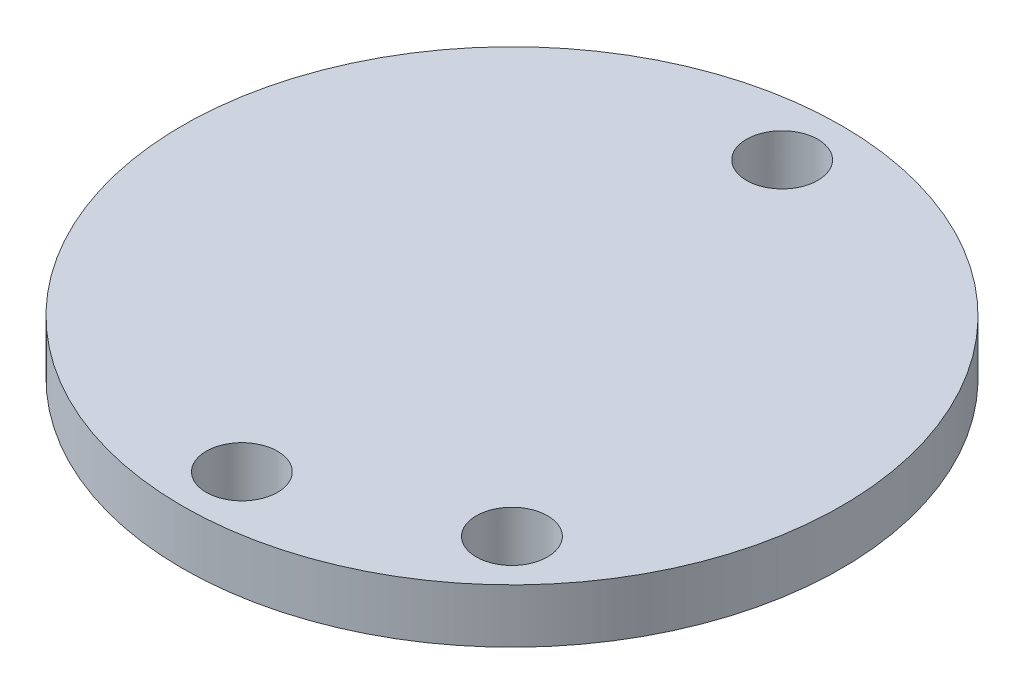
ISO-10303-21;
HEADER;
FILE_DESCRIPTION(('STEP AP214'),'2;1');
FILE_NAME('part.step','',(''),(''),'','','');
FILE_SCHEMA(('AUTOMOTIVE_DESIGN { 1 0 10303 214 1 1 1 1 }'));
ENDSEC;
DATA;
#1=APPLICATION_CONTEXT('core data for automotive mechanical design processes');
#2=APPLICATION_PROTOCOL_DEFINITION('international standard','automotive_design',2000,#1);
#3=PRODUCT_CONTEXT('',#1,'mechanical');
#4=PRODUCT('Part','Part','',(#3));
#5=PRODUCT_RELATED_PRODUCT_CATEGORY('part','',(#4));
#6=PRODUCT_DEFINITION_FORMATION('','',#4);
#7=PRODUCT_DEFINITION_CONTEXT('part definition',#1,'design');
#8=PRODUCT_DEFINITION('design','',#6,#7);
#9=PRODUCT_DEFINITION_SHAPE('','',#8);
#10=(LENGTH_UNIT() NAMED_UNIT(*) SI_UNIT(.MILLI.,.METRE.));
#11=(NAMED_UNIT(*) PLANE_ANGLE_UNIT() SI_UNIT($,.RADIAN.));
#12=(NAMED_UNIT(*) SI_UNIT($,.STERADIAN.) SOLID_ANGLE_UNIT());
#13=UNCERTAINTY_MEASURE_WITH_UNIT(LENGTH_MEASURE(1.E-05),#10,'distance_accuracy_value','');
#14=(GEOMETRIC_REPRESENTATION_CONTEXT(3) GLOBAL_UNCERTAINTY_ASSIGNED_CONTEXT((#13)) GLOBAL_UNIT_ASSIGNED_CONTEXT((#10,
#11,#12)) REPRESENTATION_CONTEXT('',''));
#15=CARTESIAN_POINT('',(0.,0.,0.));
#16=DIRECTION('',(0.,0.,1.));
#17=DIRECTION('',(1.,0.,0.));
#18=AXIS2_PLACEMENT_3D('',#15,#16,#17);
#19=CARTESIAN_POINT('',(0.,5.,0.));
#20=DIRECTION('',(0.,-1.,0.));
#21=DIRECTION('',(0.,0.,-1.));
#22=AXIS2_PLACEMENT_3D('',#19,#20,#21);
#23=CYLINDRICAL_SURFACE('',#22,30.5);
#24=CARTESIAN_POINT('',(0.,5.,0.));
#25=DIRECTION('',(0.,1.,0.));
#26=DIRECTION('',(0.,0.,1.));
#27=AXIS2_PLACEMENT_3D('',#24,#25,#26);
#28=CIRCLE('',#27,30.5);
#29=CARTESIAN_POINT('',(0.,5.,30.5));
#30=VERTEX_POINT('',#29);
#31=EDGE_CURVE('E10',#30,#30,#28,.T.);
#32=ORIENTED_EDGE('',*,*,#31,.F.);
#33=EDGE_LOOP('',(#32));
#34=FACE_BOUND('',#33,.T.);
#35=CARTESIAN_POINT('',(0.,0.,0.));
#36=DIRECTION('',(0.,1.,0.));
#37=DIRECTION('',(0.,0.,1.));
#38=AXIS2_PLACEMENT_3D('',#35,#36,#37);
#39=CIRCLE('',#38,30.5);
#40=CARTESIAN_POINT('',(0.,0.,30.5));
#41=VERTEX_POINT('',#40);
#42=EDGE_CURVE('E40',#41,#41,#39,.T.);
#43=ORIENTED_EDGE('',*,*,#42,.T.);
#44=EDGE_LOOP('',(#43));
#45=FACE_BOUND('',#44,.T.);
#46=ADVANCED_FACE('F37',(#34,#45),#23,.T.);
#47=CARTESIAN_POINT('',(0.,5.,0.));
#48=DIRECTION('',(0.,1.,0.));
#49=DIRECTION('',(0.,0.,1.));
#50=AXIS2_PLACEMENT_3D('',#47,#48,#49);
#51=PLANE('',#50);
#52=CARTESIAN_POINT('',(17.6744764826842,5.,17.680862));
#53=DIRECTION('',(0.,1.,0.));
#54=DIRECTION('',(0.,0.,1.));
#55=AXIS2_PLACEMENT_3D('',#52,#53,#54);
#56=CIRCLE('',#55,3.302);
#57=CARTESIAN_POINT('',(17.6744764826842,5.,20.982862));
#58=VERTEX_POINT('',#57);
#59=EDGE_CURVE('E66',#58,#58,#56,.T.);
#60=ORIENTED_EDGE('',*,*,#59,.F.);
#61=EDGE_LOOP('',(#60));
#62=FACE_BOUND('',#61,.T.);
#63=CARTESIAN_POINT('',(0.,5.,25.));
#64=DIRECTION('',(0.,1.,0.));
#65=DIRECTION('',(0.,0.,1.));
#66=AXIS2_PLACEMENT_3D('',#63,#64,#65);
#67=CIRCLE('',#66,3.302);
#68=CARTESIAN_POINT('',(0.,5.,28.302));
#69=VERTEX_POINT('',#68);
#70=EDGE_CURVE('E58',#69,#69,#67,.T.);
#71=ORIENTED_EDGE('',*,*,#70,.F.);
#72=EDGE_LOOP('',(#71));
#73=FACE_BOUND('',#72,.T.);
#74=CARTESIAN_POINT('',(0.,5.,-25.));
#75=DIRECTION('',(0.,1.,0.));
#76=DIRECTION('',(0.,0.,1.));
#77=AXIS2_PLACEMENT_3D('',#74,#75,#76);
#78=CIRCLE('',#77,3.302);
#79=CARTESIAN_POINT('',(0.,5.,-21.698));
#80=VERTEX_POINT('',#79);
#81=EDGE_CURVE('E49',#80,#80,#78,.T.);
#82=ORIENTED_EDGE('',*,*,#81,.F.);
#83=EDGE_LOOP('',(#82));
#84=FACE_BOUND('',#83,.T.);
#85=ORIENTED_EDGE('',*,*,#31,.T.);
#86=EDGE_LOOP('',(#85));
#87=FACE_BOUND('',#86,.T.);
#88=ADVANCED_FACE('F81',(#62,#73,#84,#87),#51,.T.);
#89=CARTESIAN_POINT('',(0.,0.,0.));
#90=DIRECTION('',(0.,1.,0.));
#91=DIRECTION('',(0.,0.,1.));
#92=AXIS2_PLACEMENT_3D('',#89,#90,#91);
#93=PLANE('',#92);
#94=CARTESIAN_POINT('',(17.6744764826842,0.,17.680862));
#95=DIRECTION('',(0.,-1.,0.));
#96=DIRECTION('',(0.,0.,-1.));
#97=AXIS2_PLACEMENT_3D('',#94,#95,#96);
#98=CIRCLE('',#97,3.302);
#99=CARTESIAN_POINT('',(17.6744764826842,0.,14.378862));
#100=VERTEX_POINT('',#99);
#101=EDGE_CURVE('E70',#100,#100,#98,.T.);
#102=ORIENTED_EDGE('',*,*,#101,.F.);
#103=EDGE_LOOP('',(#102));
#104=FACE_BOUND('',#103,.T.);
#105=CARTESIAN_POINT('',(0.,0.,25.));
#106=DIRECTION('',(0.,-1.,0.));
#107=DIRECTION('',(0.,0.,-1.));
#108=AXIS2_PLACEMENT_3D('',#105,#106,#107);
#109=CIRCLE('',#108,3.302);
#110=CARTESIAN_POINT('',(0.,0.,21.698));
#111=VERTEX_POINT('',#110);
#112=EDGE_CURVE('E62',#111,#111,#109,.T.);
#113=ORIENTED_EDGE('',*,*,#112,.F.);
#114=EDGE_LOOP('',(#113));
#115=FACE_BOUND('',#114,.T.);
#116=CARTESIAN_POINT('',(0.,0.,-25.));
#117=DIRECTION('',(0.,-1.,0.));
#118=DIRECTION('',(0.,0.,-1.));
#119=AXIS2_PLACEMENT_3D('',#116,#117,#118);
#120=CIRCLE('',#119,3.302);
#121=CARTESIAN_POINT('',(0.,0.,-28.302));
#122=VERTEX_POINT('',#121);
#123=EDGE_CURVE('E54',#122,#122,#120,.T.);
#124=ORIENTED_EDGE('',*,*,#123,.F.);
#125=EDGE_LOOP('',(#124));
#126=FACE_BOUND('',#125,.T.);
#127=ORIENTED_EDGE('',*,*,#42,.F.);
#128=EDGE_LOOP('',(#127));
#129=FACE_BOUND('',#128,.T.);
#130=ADVANCED_FACE('F77',(#104,#115,#126,#129),#93,.F.);
#131=CARTESIAN_POINT('',(0.,5.08,-25.));
#132=DIRECTION('',(0.,-1.,0.));
#133=DIRECTION('',(0.,0.,-1.));
#134=AXIS2_PLACEMENT_3D('',#131,#132,#133);
#135=CYLINDRICAL_SURFACE('',#134,3.302);
#136=ORIENTED_EDGE('',*,*,#81,.T.);
#137=EDGE_LOOP('',(#136));
#138=FACE_BOUND('',#137,.T.);
#139=ORIENTED_EDGE('',*,*,#123,.T.);
#140=EDGE_LOOP('',(#139));
#141=FACE_BOUND('',#140,.T.);
#142=ADVANCED_FACE('F80',(#138,#141),#135,.F.);
#143=CARTESIAN_POINT('',(0.,5.08,25.));
#144=DIRECTION('',(0.,-1.,0.));
#145=DIRECTION('',(0.,0.,-1.));
#146=AXIS2_PLACEMENT_3D('',#143,#144,#145);
#147=CYLINDRICAL_SURFACE('',#146,3.302);
#148=ORIENTED_EDGE('',*,*,#70,.T.);
#149=EDGE_LOOP('',(#148));
#150=FACE_BOUND('',#149,.T.);
#151=ORIENTED_EDGE('',*,*,#112,.T.);
#152=EDGE_LOOP('',(#151));
#153=FACE_BOUND('',#152,.T.);
#154=ADVANCED_FACE('F102',(#150,#153),#147,.F.);
#155=CARTESIAN_POINT('',(17.6744764826842,5.08,17.680862));
#156=DIRECTION('',(0.,-1.,0.));
#157=DIRECTION('',(0.,0.,-1.));
#158=AXIS2_PLACEMENT_3D('',#155,#156,#157);
#159=CYLINDRICAL_SURFACE('',#158,3.302);
#160=ORIENTED_EDGE('',*,*,#59,.T.);
#161=EDGE_LOOP('',(#160));
#162=FACE_BOUND('',#161,.T.);
#163=ORIENTED_EDGE('',*,*,#101,.T.);
#164=EDGE_LOOP('',(#163));
#165=FACE_BOUND('',#164,.T.);
#166=ADVANCED_FACE('F75',(#162,#165),#159,.F.);
#167=CLOSED_SHELL('',(#46,#88,#130,#142,#154,#166));
#168=MANIFOLD_SOLID_BREP('B2',#167);
#169=ADVANCED_BREP_SHAPE_REPRESENTATION('',(#18,#168),#14);
#170=SHAPE_DEFINITION_REPRESENTATION(#9,#169);
ENDSEC;
END-ISO-10303-21;
